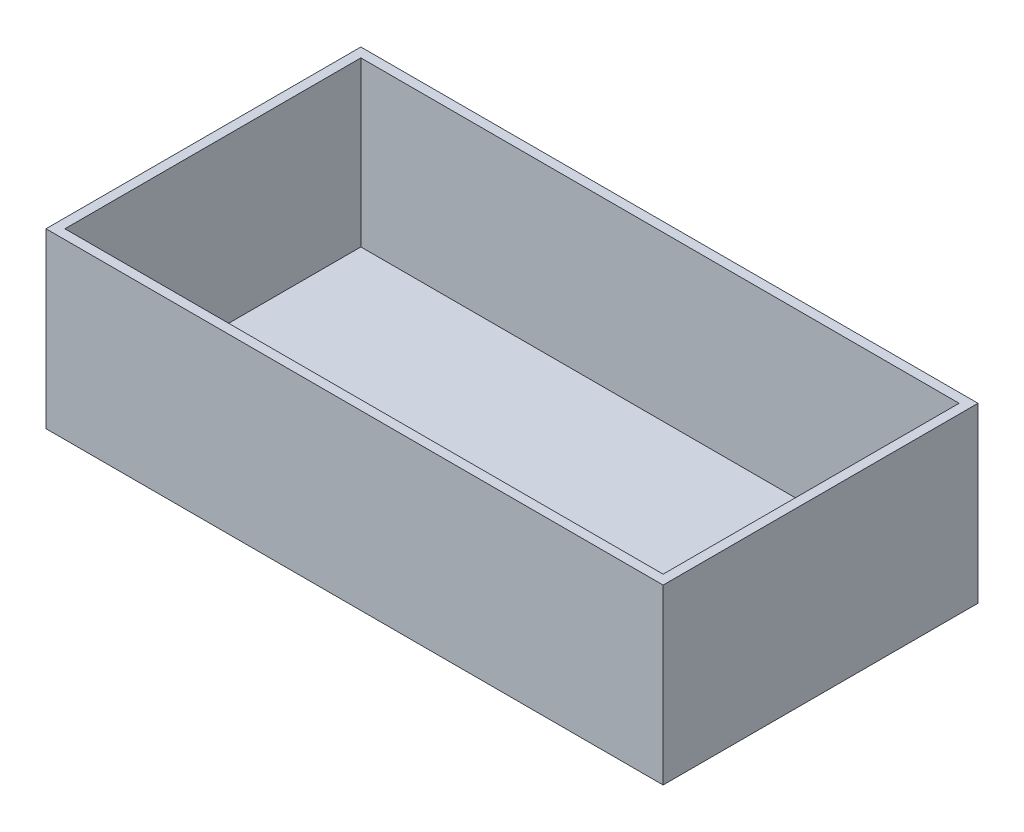
ISO-10303-21;
HEADER;
FILE_DESCRIPTION(('STEP AP214'),'2;1');
FILE_NAME('part.step','',(''),(''),'','','');
FILE_SCHEMA(('AUTOMOTIVE_DESIGN { 1 0 10303 214 1 1 1 1 }'));
ENDSEC;
DATA;
#1=APPLICATION_CONTEXT('core data for automotive mechanical design processes');
#2=APPLICATION_PROTOCOL_DEFINITION('international standard','automotive_design',2000,#1);
#3=PRODUCT_CONTEXT('',#1,'mechanical');
#4=PRODUCT('Part','Part','',(#3));
#5=PRODUCT_RELATED_PRODUCT_CATEGORY('part','',(#4));
#6=PRODUCT_DEFINITION_FORMATION('','',#4);
#7=PRODUCT_DEFINITION_CONTEXT('part definition',#1,'design');
#8=PRODUCT_DEFINITION('design','',#6,#7);
#9=PRODUCT_DEFINITION_SHAPE('','',#8);
#10=(LENGTH_UNIT() NAMED_UNIT(*) SI_UNIT(.MILLI.,.METRE.));
#11=(NAMED_UNIT(*) PLANE_ANGLE_UNIT() SI_UNIT($,.RADIAN.));
#12=(NAMED_UNIT(*) SI_UNIT($,.STERADIAN.) SOLID_ANGLE_UNIT());
#13=UNCERTAINTY_MEASURE_WITH_UNIT(LENGTH_MEASURE(1.E-05),#10,'distance_accuracy_value','');
#14=(GEOMETRIC_REPRESENTATION_CONTEXT(3) GLOBAL_UNCERTAINTY_ASSIGNED_CONTEXT((#13)) GLOBAL_UNIT_ASSIGNED_CONTEXT((#10,
#11,#12)) REPRESENTATION_CONTEXT('',''));
#15=CARTESIAN_POINT('',(0.,0.,0.));
#16=DIRECTION('',(0.,0.,1.));
#17=DIRECTION('',(1.,0.,0.));
#18=AXIS2_PLACEMENT_3D('',#15,#16,#17);
#19=CARTESIAN_POINT('',(98.,55.,50.));
#20=DIRECTION('',(-1.,0.,0.));
#21=DIRECTION('',(0.,0.,1.));
#22=AXIS2_PLACEMENT_3D('',#19,#20,#21);
#23=PLANE('',#22);
#24=DIRECTION('',(0.,0.,-1.));
#25=VECTOR('',#24,1.);
#26=CARTESIAN_POINT('',(98.,0.,50.));
#27=LINE('',#26,#25);
#28=CARTESIAN_POINT('',(98.,0.,50.));
#29=VERTEX_POINT('',#28);
#30=CARTESIAN_POINT('',(98.,0.,-50.));
#31=VERTEX_POINT('',#30);
#32=EDGE_CURVE('E141',#29,#31,#27,.T.);
#33=ORIENTED_EDGE('',*,*,#32,.T.);
#34=DIRECTION('',(0.,-1.,0.));
#35=VECTOR('',#34,1.);
#36=CARTESIAN_POINT('',(98.,55.,-50.));
#37=LINE('',#36,#35);
#38=CARTESIAN_POINT('',(98.,55.,-50.));
#39=VERTEX_POINT('',#38);
#40=EDGE_CURVE('E11',#39,#31,#37,.T.);
#41=ORIENTED_EDGE('',*,*,#40,.F.);
#42=DIRECTION('',(0.,0.,-1.));
#43=VECTOR('',#42,1.);
#44=CARTESIAN_POINT('',(98.,55.,50.));
#45=LINE('',#44,#43);
#46=CARTESIAN_POINT('',(98.,55.,50.));
#47=VERTEX_POINT('',#46);
#48=EDGE_CURVE('E145',#47,#39,#45,.T.);
#49=ORIENTED_EDGE('',*,*,#48,.F.);
#50=DIRECTION('',(0.,-1.,0.));
#51=VECTOR('',#50,1.);
#52=CARTESIAN_POINT('',(98.,55.,50.));
#53=LINE('',#52,#51);
#54=EDGE_CURVE('E151',#47,#29,#53,.T.);
#55=ORIENTED_EDGE('',*,*,#54,.T.);
#56=EDGE_LOOP('',(#33,#41,#49,#55));
#57=FACE_BOUND('',#56,.T.);
#58=ADVANCED_FACE('F33',(#57),#23,.F.);
#59=CARTESIAN_POINT('',(-98.,55.,-50.));
#60=DIRECTION('',(0.,0.,1.));
#61=DIRECTION('',(1.,0.,0.));
#62=AXIS2_PLACEMENT_3D('',#59,#60,#61);
#63=PLANE('',#62);
#64=DIRECTION('',(-1.,0.,0.));
#65=VECTOR('',#64,1.);
#66=CARTESIAN_POINT('',(-98.,0.,-50.));
#67=LINE('',#66,#65);
#68=CARTESIAN_POINT('',(-98.,0.,-50.));
#69=VERTEX_POINT('',#68);
#70=EDGE_CURVE('E154',#31,#69,#67,.T.);
#71=ORIENTED_EDGE('',*,*,#70,.T.);
#72=DIRECTION('',(0.,-1.,0.));
#73=VECTOR('',#72,1.);
#74=CARTESIAN_POINT('',(-98.,55.,-50.));
#75=LINE('',#74,#73);
#76=CARTESIAN_POINT('',(-98.,55.,-50.));
#77=VERTEX_POINT('',#76);
#78=EDGE_CURVE('E40',#77,#69,#75,.T.);
#79=ORIENTED_EDGE('',*,*,#78,.F.);
#80=DIRECTION('',(-1.,0.,0.));
#81=VECTOR('',#80,1.);
#82=CARTESIAN_POINT('',(-98.,55.,-50.));
#83=LINE('',#82,#81);
#84=EDGE_CURVE('E84',#39,#77,#83,.T.);
#85=ORIENTED_EDGE('',*,*,#84,.F.);
#86=ORIENTED_EDGE('',*,*,#40,.T.);
#87=EDGE_LOOP('',(#71,#79,#85,#86));
#88=FACE_BOUND('',#87,.T.);
#89=ADVANCED_FACE('F183',(#88),#63,.F.);
#90=CARTESIAN_POINT('',(-98.,55.,50.));
#91=DIRECTION('',(1.,0.,0.));
#92=DIRECTION('',(0.,0.,-1.));
#93=AXIS2_PLACEMENT_3D('',#90,#91,#92);
#94=PLANE('',#93);
#95=DIRECTION('',(0.,0.,1.));
#96=VECTOR('',#95,1.);
#97=CARTESIAN_POINT('',(-98.,0.,50.));
#98=LINE('',#97,#96);
#99=CARTESIAN_POINT('',(-98.,0.,50.));
#100=VERTEX_POINT('',#99);
#101=EDGE_CURVE('E156',#69,#100,#98,.T.);
#102=ORIENTED_EDGE('',*,*,#101,.T.);
#103=DIRECTION('',(0.,-1.,0.));
#104=VECTOR('',#103,1.);
#105=CARTESIAN_POINT('',(-98.,55.,50.));
#106=LINE('',#105,#104);
#107=CARTESIAN_POINT('',(-98.,55.,50.));
#108=VERTEX_POINT('',#107);
#109=EDGE_CURVE('E160',#108,#100,#106,.T.);
#110=ORIENTED_EDGE('',*,*,#109,.F.);
#111=DIRECTION('',(0.,0.,1.));
#112=VECTOR('',#111,1.);
#113=CARTESIAN_POINT('',(-98.,55.,50.));
#114=LINE('',#113,#112);
#115=EDGE_CURVE('E148',#77,#108,#114,.T.);
#116=ORIENTED_EDGE('',*,*,#115,.F.);
#117=ORIENTED_EDGE('',*,*,#78,.T.);
#118=EDGE_LOOP('',(#102,#110,#116,#117));
#119=FACE_BOUND('',#118,.T.);
#120=ADVANCED_FACE('F165',(#119),#94,.F.);
#121=CARTESIAN_POINT('',(-98.,55.,50.));
#122=DIRECTION('',(0.,0.,-1.));
#123=DIRECTION('',(-1.,0.,0.));
#124=AXIS2_PLACEMENT_3D('',#121,#122,#123);
#125=PLANE('',#124);
#126=DIRECTION('',(1.,0.,0.));
#127=VECTOR('',#126,1.);
#128=CARTESIAN_POINT('',(-98.,0.,50.));
#129=LINE('',#128,#127);
#130=EDGE_CURVE('E77',#100,#29,#129,.T.);
#131=ORIENTED_EDGE('',*,*,#130,.T.);
#132=ORIENTED_EDGE('',*,*,#54,.F.);
#133=DIRECTION('',(1.,0.,0.));
#134=VECTOR('',#133,1.);
#135=CARTESIAN_POINT('',(-98.,55.,50.));
#136=LINE('',#135,#134);
#137=EDGE_CURVE('E56',#108,#47,#136,.T.);
#138=ORIENTED_EDGE('',*,*,#137,.F.);
#139=ORIENTED_EDGE('',*,*,#109,.T.);
#140=EDGE_LOOP('',(#131,#132,#138,#139));
#141=FACE_BOUND('',#140,.T.);
#142=ADVANCED_FACE('F173',(#141),#125,.F.);
#143=CARTESIAN_POINT('',(0.,55.,0.));
#144=DIRECTION('',(0.,-1.,0.));
#145=DIRECTION('',(0.,0.,-1.));
#146=AXIS2_PLACEMENT_3D('',#143,#144,#145);
#147=PLANE('',#146);
#148=DIRECTION('',(-1.,0.,0.));
#149=VECTOR('',#148,1.);
#150=CARTESIAN_POINT('',(-95.0000000000001,55.,-47.));
#151=LINE('',#150,#149);
#152=CARTESIAN_POINT('',(95.,55.,-47.));
#153=VERTEX_POINT('',#152);
#154=CARTESIAN_POINT('',(-95.0000000000001,55.,-47.));
#155=VERTEX_POINT('',#154);
#156=EDGE_CURVE('E135',#153,#155,#151,.T.);
#157=ORIENTED_EDGE('',*,*,#156,.F.);
#158=DIRECTION('',(0.,0.,-1.));
#159=VECTOR('',#158,1.);
#160=CARTESIAN_POINT('',(95.,55.,47.));
#161=LINE('',#160,#159);
#162=CARTESIAN_POINT('',(95.,55.,47.));
#163=VERTEX_POINT('',#162);
#164=EDGE_CURVE('E47',#163,#153,#161,.T.);
#165=ORIENTED_EDGE('',*,*,#164,.F.);
#166=DIRECTION('',(1.,0.,0.));
#167=VECTOR('',#166,1.);
#168=CARTESIAN_POINT('',(-95.0000000000001,55.,47.));
#169=LINE('',#168,#167);
#170=CARTESIAN_POINT('',(-95.0000000000001,55.,47.));
#171=VERTEX_POINT('',#170);
#172=EDGE_CURVE('E126',#171,#163,#169,.T.);
#173=ORIENTED_EDGE('',*,*,#172,.F.);
#174=DIRECTION('',(0.,0.,1.));
#175=VECTOR('',#174,1.);
#176=CARTESIAN_POINT('',(-95.0000000000001,55.,47.));
#177=LINE('',#176,#175);
#178=EDGE_CURVE('E129',#155,#171,#177,.T.);
#179=ORIENTED_EDGE('',*,*,#178,.F.);
#180=EDGE_LOOP('',(#157,#165,#173,#179));
#181=FACE_BOUND('',#180,.T.);
#182=ORIENTED_EDGE('',*,*,#48,.T.);
#183=ORIENTED_EDGE('',*,*,#84,.T.);
#184=ORIENTED_EDGE('',*,*,#115,.T.);
#185=ORIENTED_EDGE('',*,*,#137,.T.);
#186=EDGE_LOOP('',(#182,#183,#184,#185));
#187=FACE_BOUND('',#186,.T.);
#188=ADVANCED_FACE('F175',(#181,#187),#147,.F.);
#189=CARTESIAN_POINT('',(0.,0.,0.));
#190=DIRECTION('',(0.,-1.,0.));
#191=DIRECTION('',(0.,0.,-1.));
#192=AXIS2_PLACEMENT_3D('',#189,#190,#191);
#193=PLANE('',#192);
#194=ORIENTED_EDGE('',*,*,#32,.F.);
#195=ORIENTED_EDGE('',*,*,#130,.F.);
#196=ORIENTED_EDGE('',*,*,#101,.F.);
#197=ORIENTED_EDGE('',*,*,#70,.F.);
#198=EDGE_LOOP('',(#194,#195,#196,#197));
#199=FACE_BOUND('',#198,.T.);
#200=ADVANCED_FACE('F169',(#199),#193,.T.);
#201=CARTESIAN_POINT('',(95.,3.,47.));
#202=DIRECTION('',(1.,0.,0.));
#203=DIRECTION('',(0.,0.,-1.));
#204=AXIS2_PLACEMENT_3D('',#201,#202,#203);
#205=PLANE('',#204);
#206=ORIENTED_EDGE('',*,*,#164,.T.);
#207=DIRECTION('',(0.,1.,0.));
#208=VECTOR('',#207,1.);
#209=CARTESIAN_POINT('',(95.,3.,-47.));
#210=LINE('',#209,#208);
#211=CARTESIAN_POINT('',(95.,3.,-47.));
#212=VERTEX_POINT('',#211);
#213=EDGE_CURVE('E104',#212,#153,#210,.T.);
#214=ORIENTED_EDGE('',*,*,#213,.F.);
#215=DIRECTION('',(0.,0.,-1.));
#216=VECTOR('',#215,1.);
#217=CARTESIAN_POINT('',(95.,3.,47.));
#218=LINE('',#217,#216);
#219=CARTESIAN_POINT('',(95.,3.,47.));
#220=VERTEX_POINT('',#219);
#221=EDGE_CURVE('E108',#220,#212,#218,.T.);
#222=ORIENTED_EDGE('',*,*,#221,.F.);
#223=DIRECTION('',(0.,1.,0.));
#224=VECTOR('',#223,1.);
#225=CARTESIAN_POINT('',(95.,3.,47.));
#226=LINE('',#225,#224);
#227=EDGE_CURVE('E139',#220,#163,#226,.T.);
#228=ORIENTED_EDGE('',*,*,#227,.T.);
#229=EDGE_LOOP('',(#206,#214,#222,#228));
#230=FACE_BOUND('',#229,.T.);
#231=ADVANCED_FACE('F106',(#230),#205,.F.);
#232=CARTESIAN_POINT('',(-95.0000000000001,3.,47.));
#233=DIRECTION('',(0.,0.,1.));
#234=DIRECTION('',(1.,0.,0.));
#235=AXIS2_PLACEMENT_3D('',#232,#233,#234);
#236=PLANE('',#235);
#237=ORIENTED_EDGE('',*,*,#172,.T.);
#238=ORIENTED_EDGE('',*,*,#227,.F.);
#239=DIRECTION('',(1.,0.,0.));
#240=VECTOR('',#239,1.);
#241=CARTESIAN_POINT('',(-95.0000000000001,3.,47.));
#242=LINE('',#241,#240);
#243=CARTESIAN_POINT('',(-95.0000000000001,3.,47.));
#244=VERTEX_POINT('',#243);
#245=EDGE_CURVE('E114',#244,#220,#242,.T.);
#246=ORIENTED_EDGE('',*,*,#245,.F.);
#247=DIRECTION('',(0.,1.,0.));
#248=VECTOR('',#247,1.);
#249=CARTESIAN_POINT('',(-95.0000000000001,3.,47.));
#250=LINE('',#249,#248);
#251=EDGE_CURVE('E142',#244,#171,#250,.T.);
#252=ORIENTED_EDGE('',*,*,#251,.T.);
#253=EDGE_LOOP('',(#237,#238,#246,#252));
#254=FACE_BOUND('',#253,.T.);
#255=ADVANCED_FACE('F222',(#254),#236,.F.);
#256=CARTESIAN_POINT('',(-95.0000000000001,3.,47.));
#257=DIRECTION('',(-1.,0.,0.));
#258=DIRECTION('',(0.,0.,1.));
#259=AXIS2_PLACEMENT_3D('',#256,#257,#258);
#260=PLANE('',#259);
#261=ORIENTED_EDGE('',*,*,#178,.T.);
#262=ORIENTED_EDGE('',*,*,#251,.F.);
#263=DIRECTION('',(0.,0.,1.));
#264=VECTOR('',#263,1.);
#265=CARTESIAN_POINT('',(-95.0000000000001,3.,47.));
#266=LINE('',#265,#264);
#267=CARTESIAN_POINT('',(-95.0000000000001,3.,-47.));
#268=VERTEX_POINT('',#267);
#269=EDGE_CURVE('E122',#268,#244,#266,.T.);
#270=ORIENTED_EDGE('',*,*,#269,.F.);
#271=DIRECTION('',(0.,1.,0.));
#272=VECTOR('',#271,1.);
#273=CARTESIAN_POINT('',(-95.0000000000001,3.,-47.));
#274=LINE('',#273,#272);
#275=EDGE_CURVE('E113',#268,#155,#274,.T.);
#276=ORIENTED_EDGE('',*,*,#275,.T.);
#277=EDGE_LOOP('',(#261,#262,#270,#276));
#278=FACE_BOUND('',#277,.T.);
#279=ADVANCED_FACE('F231',(#278),#260,.F.);
#280=CARTESIAN_POINT('',(-95.0000000000001,3.,-47.));
#281=DIRECTION('',(0.,0.,-1.));
#282=DIRECTION('',(-1.,0.,0.));
#283=AXIS2_PLACEMENT_3D('',#280,#281,#282);
#284=PLANE('',#283);
#285=ORIENTED_EDGE('',*,*,#156,.T.);
#286=ORIENTED_EDGE('',*,*,#275,.F.);
#287=DIRECTION('',(-1.,0.,0.));
#288=VECTOR('',#287,1.);
#289=CARTESIAN_POINT('',(-95.0000000000001,3.,-47.));
#290=LINE('',#289,#288);
#291=EDGE_CURVE('E117',#212,#268,#290,.T.);
#292=ORIENTED_EDGE('',*,*,#291,.F.);
#293=ORIENTED_EDGE('',*,*,#213,.T.);
#294=EDGE_LOOP('',(#285,#286,#292,#293));
#295=FACE_BOUND('',#294,.T.);
#296=ADVANCED_FACE('F118',(#295),#284,.F.);
#297=CARTESIAN_POINT('',(0.,3.,0.));
#298=DIRECTION('',(0.,-1.,0.));
#299=DIRECTION('',(0.,0.,-1.));
#300=AXIS2_PLACEMENT_3D('',#297,#298,#299);
#301=PLANE('',#300);
#302=ORIENTED_EDGE('',*,*,#221,.T.);
#303=ORIENTED_EDGE('',*,*,#291,.T.);
#304=ORIENTED_EDGE('',*,*,#269,.T.);
#305=ORIENTED_EDGE('',*,*,#245,.T.);
#306=EDGE_LOOP('',(#302,#303,#304,#305));
#307=FACE_BOUND('',#306,.T.);
#308=ADVANCED_FACE('F124',(#307),#301,.F.);
#309=CLOSED_SHELL('',(#58,#89,#120,#142,#188,#200,#231,#255,#279,#296,#308));
#310=MANIFOLD_SOLID_BREP('B2',#309);
#311=ADVANCED_BREP_SHAPE_REPRESENTATION('',(#18,#310),#14);
#312=SHAPE_DEFINITION_REPRESENTATION(#9,#311);
ENDSEC;
END-ISO-10303-21;
